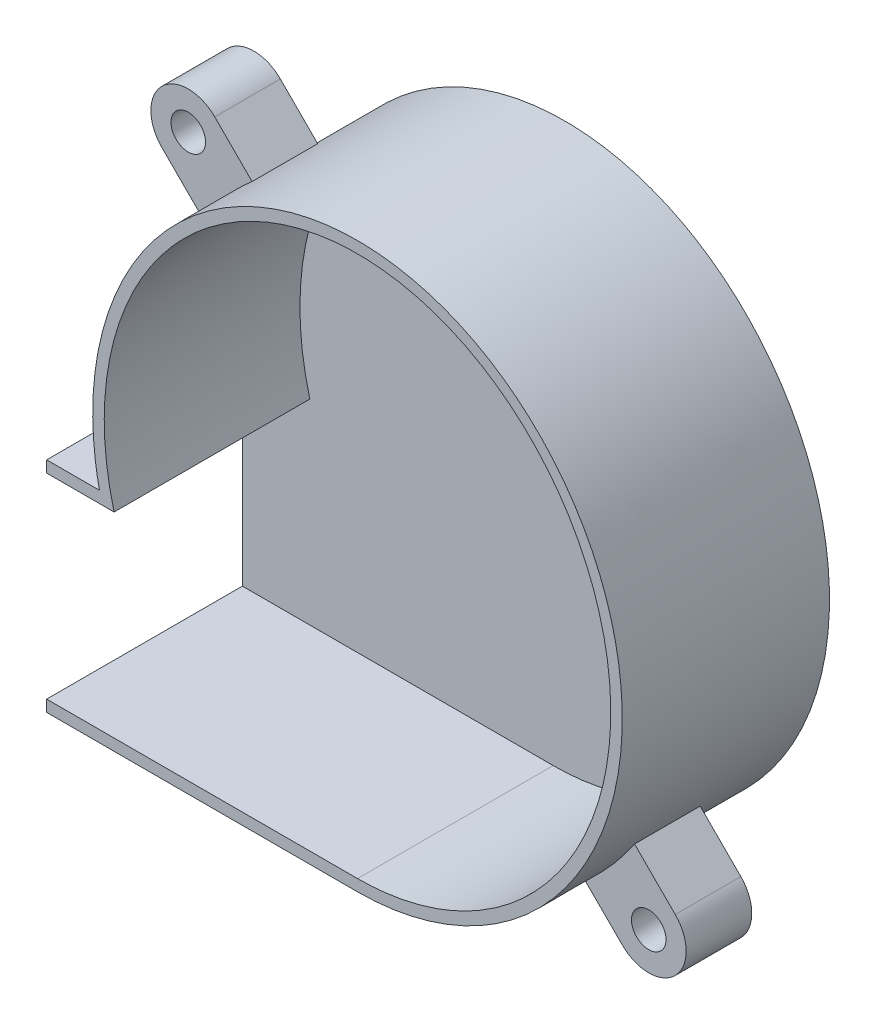
ISO-10303-21;
HEADER;
FILE_DESCRIPTION(('STEP AP214'),'2;1');
FILE_NAME('part.step','',(''),(''),'','','');
FILE_SCHEMA(('AUTOMOTIVE_DESIGN { 1 0 10303 214 1 1 1 1 }'));
ENDSEC;
DATA;
#1=APPLICATION_CONTEXT('core data for automotive mechanical design processes');
#2=APPLICATION_PROTOCOL_DEFINITION('international standard','automotive_design',2000,#1);
#3=PRODUCT_CONTEXT('',#1,'mechanical');
#4=PRODUCT('Part','Part','',(#3));
#5=PRODUCT_RELATED_PRODUCT_CATEGORY('part','',(#4));
#6=PRODUCT_DEFINITION_FORMATION('','',#4);
#7=PRODUCT_DEFINITION_CONTEXT('part definition',#1,'design');
#8=PRODUCT_DEFINITION('design','',#6,#7);
#9=PRODUCT_DEFINITION_SHAPE('','',#8);
#10=(LENGTH_UNIT() NAMED_UNIT(*) SI_UNIT(.MILLI.,.METRE.));
#11=(NAMED_UNIT(*) PLANE_ANGLE_UNIT() SI_UNIT($,.RADIAN.));
#12=(NAMED_UNIT(*) SI_UNIT($,.STERADIAN.) SOLID_ANGLE_UNIT());
#13=UNCERTAINTY_MEASURE_WITH_UNIT(LENGTH_MEASURE(1.E-05),#10,'distance_accuracy_value','');
#14=(GEOMETRIC_REPRESENTATION_CONTEXT(3) GLOBAL_UNCERTAINTY_ASSIGNED_CONTEXT((#13)) GLOBAL_UNIT_ASSIGNED_CONTEXT((#10,
#11,#12)) REPRESENTATION_CONTEXT('',''));
#15=CARTESIAN_POINT('',(0.,0.,0.));
#16=DIRECTION('',(0.,0.,1.));
#17=DIRECTION('',(1.,0.,0.));
#18=AXIS2_PLACEMENT_3D('',#15,#16,#17);
#19=CARTESIAN_POINT('',(0.,0.,1.));
#20=DIRECTION('',(0.,0.,1.));
#21=DIRECTION('',(0.,1.,0.));
#22=AXIS2_PLACEMENT_3D('',#19,#20,#21);
#23=ELLIPSE('',#22,24.5,23.);
#24=DIRECTION('',(0.,0.,-1.));
#25=VECTOR('',#24,1.);
#26=SURFACE_OF_LINEAR_EXTRUSION('',#23,#25);
#27=CARTESIAN_POINT('',(0.,0.,0.));
#28=DIRECTION('',(0.,0.,1.));
#29=DIRECTION('',(0.,1.,0.));
#30=AXIS2_PLACEMENT_3D('',#27,#28,#29);
#31=ELLIPSE('',#30,24.5,23.);
#32=CARTESIAN_POINT('',(0.,-24.5,0.));
#33=VERTEX_POINT('',#32);
#34=CARTESIAN_POINT('',(-22.4129581130781,-5.5,0.));
#35=VERTEX_POINT('',#34);
#36=EDGE_CURVE('E263',#33,#35,#31,.T.);
#37=ORIENTED_EDGE('',*,*,#36,.T.);
#38=DIRECTION('',(0.,0.,-1.));
#39=VECTOR('',#38,1.);
#40=CARTESIAN_POINT('',(-22.4129581130781,-5.5,1.));
#41=LINE('',#40,#39);
#42=CARTESIAN_POINT('',(-22.4129581130781,-5.5,18.));
#43=VERTEX_POINT('',#42);
#44=EDGE_CURVE('E42',#43,#35,#41,.T.);
#45=ORIENTED_EDGE('',*,*,#44,.F.);
#46=CARTESIAN_POINT('',(0.,0.,18.));
#47=DIRECTION('',(0.,0.,1.));
#48=DIRECTION('',(0.,1.,0.));
#49=AXIS2_PLACEMENT_3D('',#46,#47,#48);
#50=ELLIPSE('',#49,24.5,23.);
#51=CARTESIAN_POINT('',(0.,-24.5,18.));
#52=VERTEX_POINT('',#51);
#53=EDGE_CURVE('E291',#52,#43,#50,.T.);
#54=ORIENTED_EDGE('',*,*,#53,.F.);
#55=DIRECTION('',(0.,0.,-1.));
#56=VECTOR('',#55,1.);
#57=CARTESIAN_POINT('',(0.,-24.5,1.));
#58=LINE('',#57,#56);
#59=EDGE_CURVE('E11',#52,#33,#58,.T.);
#60=ORIENTED_EDGE('',*,*,#59,.T.);
#61=EDGE_LOOP('',(#37,#45,#54,#60));
#62=FACE_BOUND('',#61,.T.);
#63=CARTESIAN_POINT('',(0.,0.,12.7));
#64=DIRECTION('',(0.,0.,-1.));
#65=DIRECTION('',(0.,1.,0.));
#66=AXIS2_PLACEMENT_3D('',#63,#64,#65);
#67=ELLIPSE('',#66,24.5,23.);
#68=CARTESIAN_POINT('',(18.7641912023517,-14.1679971246392,12.7));
#69=VERTEX_POINT('',#68);
#70=CARTESIAN_POINT('',(14.4579938729562,-19.0541879506688,12.7));
#71=VERTEX_POINT('',#70);
#72=EDGE_CURVE('E186',#69,#71,#67,.T.);
#73=ORIENTED_EDGE('',*,*,#72,.F.);
#74=DIRECTION('',(0.,0.,-1.));
#75=VECTOR('',#74,1.);
#76=CARTESIAN_POINT('',(18.7641912023517,-14.1679971246392,12.7));
#77=LINE('',#76,#75);
#78=CARTESIAN_POINT('',(18.7641912023517,-14.1679971246392,7.));
#79=VERTEX_POINT('',#78);
#80=EDGE_CURVE('E205',#69,#79,#77,.T.);
#81=ORIENTED_EDGE('',*,*,#80,.T.);
#82=CARTESIAN_POINT('',(0.,0.,7.));
#83=DIRECTION('',(0.,0.,-1.));
#84=DIRECTION('',(0.,1.,0.));
#85=AXIS2_PLACEMENT_3D('',#82,#83,#84);
#86=ELLIPSE('',#85,24.5,23.);
#87=CARTESIAN_POINT('',(14.4579938729562,-19.0541879506688,7.));
#88=VERTEX_POINT('',#87);
#89=EDGE_CURVE('E197',#79,#88,#86,.T.);
#90=ORIENTED_EDGE('',*,*,#89,.T.);
#91=DIRECTION('',(0.,0.,-1.));
#92=VECTOR('',#91,1.);
#93=CARTESIAN_POINT('',(14.4579938729562,-19.0541879506688,12.7));
#94=LINE('',#93,#92);
#95=EDGE_CURVE('E202',#71,#88,#94,.T.);
#96=ORIENTED_EDGE('',*,*,#95,.F.);
#97=EDGE_LOOP('',(#73,#81,#90,#96));
#98=FACE_BOUND('',#97,.T.);
#99=DIRECTION('',(0.,0.,-1.));
#100=VECTOR('',#99,1.);
#101=CARTESIAN_POINT('',(-18.7641912023517,14.1679971246392,12.7));
#102=LINE('',#101,#100);
#103=CARTESIAN_POINT('',(-18.7641912023517,14.1679971246392,12.7));
#104=VERTEX_POINT('',#103);
#105=CARTESIAN_POINT('',(-18.7641912023517,14.1679971246392,7.));
#106=VERTEX_POINT('',#105);
#107=EDGE_CURVE('E55',#104,#106,#102,.T.);
#108=ORIENTED_EDGE('',*,*,#107,.T.);
#109=CARTESIAN_POINT('',(0.,0.,7.));
#110=DIRECTION('',(0.,0.,-1.));
#111=DIRECTION('',(0.,1.,0.));
#112=AXIS2_PLACEMENT_3D('',#109,#110,#111);
#113=ELLIPSE('',#112,24.5,23.);
#114=CARTESIAN_POINT('',(-14.4579938729562,19.0541879506688,7.));
#115=VERTEX_POINT('',#114);
#116=EDGE_CURVE('E548',#106,#115,#113,.T.);
#117=ORIENTED_EDGE('',*,*,#116,.T.);
#118=DIRECTION('',(0.,0.,-1.));
#119=VECTOR('',#118,1.);
#120=CARTESIAN_POINT('',(-14.4579938729562,19.0541879506688,12.7));
#121=LINE('',#120,#119);
#122=CARTESIAN_POINT('',(-14.4579938729562,19.0541879506688,12.7));
#123=VERTEX_POINT('',#122);
#124=EDGE_CURVE('E172',#123,#115,#121,.T.);
#125=ORIENTED_EDGE('',*,*,#124,.F.);
#126=CARTESIAN_POINT('',(0.,0.,12.7));
#127=DIRECTION('',(0.,0.,-1.));
#128=DIRECTION('',(0.,1.,0.));
#129=AXIS2_PLACEMENT_3D('',#126,#127,#128);
#130=ELLIPSE('',#129,24.5,23.);
#131=EDGE_CURVE('E50',#104,#123,#130,.T.);
#132=ORIENTED_EDGE('',*,*,#131,.F.);
#133=EDGE_LOOP('',(#108,#117,#125,#132));
#134=FACE_BOUND('',#133,.T.);
#135=ADVANCED_FACE('F33',(#62,#98,#134),#26,.F.);
#136=CARTESIAN_POINT('',(0.,0.,1.));
#137=DIRECTION('',(0.,0.,1.));
#138=DIRECTION('',(1.,0.,0.));
#139=AXIS2_PLACEMENT_3D('',#136,#137,#138);
#140=PLANE('',#139);
#141=CARTESIAN_POINT('',(-21.1415560322634,-6.5,1.));
#142=CARTESIAN_POINT('',(-21.7759040850454,-4.14616663162075,1.));
#143=CARTESIAN_POINT('',(-22.3500460661726,0.776913351469055,1.));
#144=CARTESIAN_POINT('',(-21.0411485837453,8.08553426296956,1.));
#145=CARTESIAN_POINT('',(-17.6937405646126,14.6032514803996,1.));
#146=CARTESIAN_POINT('',(-12.6420113209987,19.6989015023427,1.));
#147=CARTESIAN_POINT('',(-6.38255061293039,22.8884215040737,1.));
#148=CARTESIAN_POINT('',(0.481967818505515,23.8764200203381,1.));
#149=CARTESIAN_POINT('',(7.30093031096783,22.5731099930776,1.));
#150=CARTESIAN_POINT('',(13.4271662597007,19.097124392934,1.));
#151=CARTESIAN_POINT('',(18.2691214581346,13.7715197027639,1.));
#152=CARTESIAN_POINT('',(21.3495837922645,7.10381393233231,1.));
#153=CARTESIAN_POINT('',(22.3605885719932,-0.259019098050411,1.));
#154=CARTESIAN_POINT('',(21.2003019493631,-7.59647296507907,1.));
#155=CARTESIAN_POINT('',(17.9857877784713,-14.1907372017755,1.));
#156=CARTESIAN_POINT('',(13.0370136266574,-19.4025638833507,1.));
#157=CARTESIAN_POINT('',(6.84551830863374,-22.7360633797071,1.));
#158=CARTESIAN_POINT('',(2.27634490260257,-23.5,1.));
#159=CARTESIAN_POINT('',(0.,-23.5,1.));
#160=B_SPLINE_CURVE_WITH_KNOTS('',3,(#141,#142,#143,#144,#145,#146,#147,#148,#149,#150,#151,
#152,#153,#154,#155,#156,#157,#158,#159),.UNSPECIFIED.,.F.,.F.,(4,1,1,1,1,1,1,1,1,1,1,1,1,1,1,1,
4),(-3.14159265358979,-2.82959621533012,-2.51759977707045,-2.20560333881077,-1.8936069005511,
-1.58161046229143,-1.26961402403176,-0.957617585772083,-0.64562114751241,-0.333624709252737,
-0.0216282709930642,0.290368167266609,0.602364605526281,0.914361043785954,1.22635748204563,
1.5383539203053,1.85035035856497),.UNSPECIFIED.);
#161=CARTESIAN_POINT('',(0.,-23.5,1.));
#162=VERTEX_POINT('',#161);
#163=CARTESIAN_POINT('',(-21.1415560322634,-6.5,1.));
#164=VERTEX_POINT('',#163);
#165=EDGE_CURVE('E311',#162,#164,#160,.F.);
#166=ORIENTED_EDGE('',*,*,#165,.T.);
#167=DIRECTION('',(-1.,0.,0.));
#168=VECTOR('',#167,1.);
#169=CARTESIAN_POINT('',(0.,-6.49999999999998,1.));
#170=LINE('',#169,#168);
#171=CARTESIAN_POINT('',(-27.,-6.50000000000001,1.));
#172=VERTEX_POINT('',#171);
#173=EDGE_CURVE('E258',#164,#172,#170,.T.);
#174=ORIENTED_EDGE('',*,*,#173,.T.);
#175=DIRECTION('',(0.,1.,0.));
#176=VECTOR('',#175,1.);
#177=CARTESIAN_POINT('',(-27.,-24.5,1.));
#178=LINE('',#177,#176);
#179=CARTESIAN_POINT('',(-27.,-23.5,1.));
#180=VERTEX_POINT('',#179);
#181=EDGE_CURVE('E252',#180,#172,#178,.T.);
#182=ORIENTED_EDGE('',*,*,#181,.F.);
#183=DIRECTION('',(1.,0.,0.));
#184=VECTOR('',#183,1.);
#185=CARTESIAN_POINT('',(0.,-23.5,1.));
#186=LINE('',#185,#184);
#187=EDGE_CURVE('E308',#180,#162,#186,.T.);
#188=ORIENTED_EDGE('',*,*,#187,.T.);
#189=EDGE_LOOP('',(#166,#174,#182,#188));
#190=FACE_BOUND('',#189,.T.);
#191=ADVANCED_FACE('F236',(#190),#140,.T.);
#192=CARTESIAN_POINT('',(0.,-24.5,1.));
#193=DIRECTION('',(0.,-1.,0.));
#194=DIRECTION('',(1.,0.,0.));
#195=AXIS2_PLACEMENT_3D('',#192,#193,#194);
#196=PLANE('',#195);
#197=DIRECTION('',(-1.,0.,0.));
#198=VECTOR('',#197,1.);
#199=CARTESIAN_POINT('',(0.,-24.5,0.));
#200=LINE('',#199,#198);
#201=CARTESIAN_POINT('',(-27.,-24.5,0.));
#202=VERTEX_POINT('',#201);
#203=EDGE_CURVE('E254',#33,#202,#200,.T.);
#204=ORIENTED_EDGE('',*,*,#203,.F.);
#205=ORIENTED_EDGE('',*,*,#59,.F.);
#206=DIRECTION('',(-1.,0.,0.));
#207=VECTOR('',#206,1.);
#208=CARTESIAN_POINT('',(0.,-24.5,18.));
#209=LINE('',#208,#207);
#210=CARTESIAN_POINT('',(-27.,-24.5,18.));
#211=VERTEX_POINT('',#210);
#212=EDGE_CURVE('E295',#52,#211,#209,.T.);
#213=ORIENTED_EDGE('',*,*,#212,.T.);
#214=DIRECTION('',(0.,0.,-1.));
#215=VECTOR('',#214,1.);
#216=CARTESIAN_POINT('',(-27.,-24.5,1.));
#217=LINE('',#216,#215);
#218=EDGE_CURVE('E269',#211,#202,#217,.T.);
#219=ORIENTED_EDGE('',*,*,#218,.T.);
#220=EDGE_LOOP('',(#204,#205,#213,#219));
#221=FACE_BOUND('',#220,.T.);
#222=ADVANCED_FACE('F35',(#221),#196,.T.);
#223=CARTESIAN_POINT('',(-27.,-5.50000000000001,1.));
#224=DIRECTION('',(0.,1.,0.));
#225=DIRECTION('',(-1.,0.,0.));
#226=AXIS2_PLACEMENT_3D('',#223,#224,#225);
#227=PLANE('',#226);
#228=DIRECTION('',(1.,0.,0.));
#229=VECTOR('',#228,1.);
#230=CARTESIAN_POINT('',(-27.,-5.50000000000001,0.));
#231=LINE('',#230,#229);
#232=CARTESIAN_POINT('',(-27.,-5.50000000000001,0.));
#233=VERTEX_POINT('',#232);
#234=EDGE_CURVE('E260',#233,#35,#231,.T.);
#235=ORIENTED_EDGE('',*,*,#234,.F.);
#236=DIRECTION('',(0.,0.,-1.));
#237=VECTOR('',#236,1.);
#238=CARTESIAN_POINT('',(-27.,-5.50000000000001,1.));
#239=LINE('',#238,#237);
#240=CARTESIAN_POINT('',(-27.,-5.50000000000001,18.));
#241=VERTEX_POINT('',#240);
#242=EDGE_CURVE('E266',#241,#233,#239,.T.);
#243=ORIENTED_EDGE('',*,*,#242,.F.);
#244=DIRECTION('',(1.,0.,0.));
#245=VECTOR('',#244,1.);
#246=CARTESIAN_POINT('',(0.,-5.49999999999999,18.));
#247=LINE('',#246,#245);
#248=EDGE_CURVE('E276',#241,#43,#247,.T.);
#249=ORIENTED_EDGE('',*,*,#248,.T.);
#250=ORIENTED_EDGE('',*,*,#44,.T.);
#251=EDGE_LOOP('',(#235,#243,#249,#250));
#252=FACE_BOUND('',#251,.T.);
#253=ADVANCED_FACE('F248',(#252),#227,.T.);
#254=CARTESIAN_POINT('',(-27.,-24.5,1.));
#255=DIRECTION('',(-1.,0.,0.));
#256=DIRECTION('',(0.,0.,1.));
#257=AXIS2_PLACEMENT_3D('',#254,#255,#256);
#258=PLANE('',#257);
#259=DIRECTION('',(0.,0.,-1.));
#260=VECTOR('',#259,1.);
#261=CARTESIAN_POINT('',(-27.,-23.5,18.));
#262=LINE('',#261,#260);
#263=CARTESIAN_POINT('',(-27.,-23.5,18.));
#264=VERTEX_POINT('',#263);
#265=EDGE_CURVE('E300',#264,#180,#262,.T.);
#266=ORIENTED_EDGE('',*,*,#265,.T.);
#267=ORIENTED_EDGE('',*,*,#181,.T.);
#268=DIRECTION('',(0.,0.,-1.));
#269=VECTOR('',#268,1.);
#270=CARTESIAN_POINT('',(-27.,-6.50000000000001,18.));
#271=LINE('',#270,#269);
#272=CARTESIAN_POINT('',(-27.,-6.50000000000001,18.));
#273=VERTEX_POINT('',#272);
#274=EDGE_CURVE('E293',#273,#172,#271,.T.);
#275=ORIENTED_EDGE('',*,*,#274,.F.);
#276=DIRECTION('',(0.,1.,0.));
#277=VECTOR('',#276,1.);
#278=CARTESIAN_POINT('',(-27.,0.,18.));
#279=LINE('',#278,#277);
#280=EDGE_CURVE('E287',#273,#241,#279,.T.);
#281=ORIENTED_EDGE('',*,*,#280,.T.);
#282=ORIENTED_EDGE('',*,*,#242,.T.);
#283=DIRECTION('',(0.,1.,0.));
#284=VECTOR('',#283,1.);
#285=CARTESIAN_POINT('',(-27.,-24.5,0.));
#286=LINE('',#285,#284);
#287=EDGE_CURVE('E257',#202,#233,#286,.T.);
#288=ORIENTED_EDGE('',*,*,#287,.F.);
#289=ORIENTED_EDGE('',*,*,#218,.F.);
#290=EDGE_CURVE('E294',#211,#264,#279,.T.);
#291=ORIENTED_EDGE('',*,*,#290,.T.);
#292=EDGE_LOOP('',(#266,#267,#275,#281,#282,#288,#289,#291));
#293=FACE_BOUND('',#292,.T.);
#294=ADVANCED_FACE('F242',(#293),#258,.T.);
#295=CARTESIAN_POINT('',(0.,0.,0.));
#296=DIRECTION('',(0.,0.,1.));
#297=DIRECTION('',(1.,0.,0.));
#298=AXIS2_PLACEMENT_3D('',#295,#296,#297);
#299=PLANE('',#298);
#300=ORIENTED_EDGE('',*,*,#287,.T.);
#301=ORIENTED_EDGE('',*,*,#234,.T.);
#302=ORIENTED_EDGE('',*,*,#36,.F.);
#303=ORIENTED_EDGE('',*,*,#203,.T.);
#304=EDGE_LOOP('',(#300,#301,#302,#303));
#305=FACE_BOUND('',#304,.T.);
#306=ADVANCED_FACE('F234',(#305),#299,.F.);
#307=CARTESIAN_POINT('',(0.,-6.49999999999998,18.));
#308=DIRECTION('',(0.,1.,0.));
#309=DIRECTION('',(-1.,0.,0.));
#310=AXIS2_PLACEMENT_3D('',#307,#308,#309);
#311=PLANE('',#310);
#312=ORIENTED_EDGE('',*,*,#173,.F.);
#313=DIRECTION('',(0.,0.,-1.));
#314=VECTOR('',#313,1.);
#315=CARTESIAN_POINT('',(-21.1415560322634,-6.5,18.));
#316=LINE('',#315,#314);
#317=CARTESIAN_POINT('',(-21.1415560322634,-6.5,18.));
#318=VERTEX_POINT('',#317);
#319=EDGE_CURVE('E305',#318,#164,#316,.T.);
#320=ORIENTED_EDGE('',*,*,#319,.F.);
#321=DIRECTION('',(1.,0.,0.));
#322=VECTOR('',#321,1.);
#323=CARTESIAN_POINT('',(0.,-6.49999999999998,18.));
#324=LINE('',#323,#322);
#325=EDGE_CURVE('E210',#273,#318,#324,.T.);
#326=ORIENTED_EDGE('',*,*,#325,.F.);
#327=ORIENTED_EDGE('',*,*,#274,.T.);
#328=EDGE_LOOP('',(#312,#320,#326,#327));
#329=FACE_BOUND('',#328,.T.);
#330=ADVANCED_FACE('F229',(#329),#311,.F.);
#331=CARTESIAN_POINT('',(-21.1415560322634,-6.5,18.));
#332=CARTESIAN_POINT('',(-21.7759040850454,-4.14616663162075,18.));
#333=CARTESIAN_POINT('',(-22.3500460661726,0.776913351469055,18.));
#334=CARTESIAN_POINT('',(-21.0411485837453,8.08553426296956,18.));
#335=CARTESIAN_POINT('',(-17.6937405646126,14.6032514803996,18.));
#336=CARTESIAN_POINT('',(-12.6420113209987,19.6989015023427,18.));
#337=CARTESIAN_POINT('',(-6.38255061293039,22.8884215040737,18.));
#338=CARTESIAN_POINT('',(0.481967818505515,23.8764200203381,18.));
#339=CARTESIAN_POINT('',(7.30093031096783,22.5731099930776,18.));
#340=CARTESIAN_POINT('',(13.4271662597007,19.097124392934,18.));
#341=CARTESIAN_POINT('',(18.2691214581346,13.7715197027639,18.));
#342=CARTESIAN_POINT('',(21.3495837922645,7.10381393233231,18.));
#343=CARTESIAN_POINT('',(22.3605885719932,-0.259019098050411,18.));
#344=CARTESIAN_POINT('',(21.2003019493631,-7.59647296507907,18.));
#345=CARTESIAN_POINT('',(17.9857877784713,-14.1907372017755,18.));
#346=CARTESIAN_POINT('',(13.0370136266574,-19.4025638833507,18.));
#347=CARTESIAN_POINT('',(6.84551830863374,-22.7360633797071,18.));
#348=CARTESIAN_POINT('',(2.27634490260257,-23.5,18.));
#349=CARTESIAN_POINT('',(0.,-23.5,18.));
#350=B_SPLINE_CURVE_WITH_KNOTS('',3,(#331,#332,#333,#334,#335,#336,#337,#338,#339,#340,#341,
#342,#343,#344,#345,#346,#347,#348,#349),.UNSPECIFIED.,.F.,.F.,(4,1,1,1,1,1,1,1,1,1,1,1,1,1,1,1,
4),(-3.14159265358979,-2.82959621533012,-2.51759977707045,-2.20560333881077,-1.8936069005511,
-1.58161046229143,-1.26961402403176,-0.957617585772083,-0.64562114751241,-0.333624709252737,
-0.0216282709930642,0.290368167266609,0.602364605526281,0.914361043785954,1.22635748204563,
1.5383539203053,1.85035035856497),.UNSPECIFIED.);
#351=DIRECTION('',(0.,0.,-1.));
#352=VECTOR('',#351,1.);
#353=SURFACE_OF_LINEAR_EXTRUSION('',#350,#352);
#354=ORIENTED_EDGE('',*,*,#165,.F.);
#355=DIRECTION('',(0.,0.,-1.));
#356=VECTOR('',#355,1.);
#357=CARTESIAN_POINT('',(0.,-23.5,18.));
#358=LINE('',#357,#356);
#359=CARTESIAN_POINT('',(0.,-23.5,18.));
#360=VERTEX_POINT('',#359);
#361=EDGE_CURVE('E302',#360,#162,#358,.T.);
#362=ORIENTED_EDGE('',*,*,#361,.F.);
#363=EDGE_CURVE('E213',#318,#360,#350,.T.);
#364=ORIENTED_EDGE('',*,*,#363,.F.);
#365=ORIENTED_EDGE('',*,*,#319,.T.);
#366=EDGE_LOOP('',(#354,#362,#364,#365));
#367=FACE_BOUND('',#366,.T.);
#368=ADVANCED_FACE('F224',(#367),#353,.F.);
#369=CARTESIAN_POINT('',(0.,-23.5,18.));
#370=DIRECTION('',(0.,-1.,0.));
#371=DIRECTION('',(0.,0.,-1.));
#372=AXIS2_PLACEMENT_3D('',#369,#370,#371);
#373=PLANE('',#372);
#374=ORIENTED_EDGE('',*,*,#187,.F.);
#375=ORIENTED_EDGE('',*,*,#265,.F.);
#376=DIRECTION('',(-1.,0.,0.));
#377=VECTOR('',#376,1.);
#378=CARTESIAN_POINT('',(0.,-23.5,18.));
#379=LINE('',#378,#377);
#380=EDGE_CURVE('E218',#360,#264,#379,.T.);
#381=ORIENTED_EDGE('',*,*,#380,.F.);
#382=ORIENTED_EDGE('',*,*,#361,.T.);
#383=EDGE_LOOP('',(#374,#375,#381,#382));
#384=FACE_BOUND('',#383,.T.);
#385=ADVANCED_FACE('F228',(#384),#373,.F.);
#386=CARTESIAN_POINT('',(0.,0.,18.));
#387=DIRECTION('',(0.,0.,1.));
#388=DIRECTION('',(1.,0.,0.));
#389=AXIS2_PLACEMENT_3D('',#386,#387,#388);
#390=PLANE('',#389);
#391=ORIENTED_EDGE('',*,*,#325,.T.);
#392=ORIENTED_EDGE('',*,*,#363,.T.);
#393=ORIENTED_EDGE('',*,*,#380,.T.);
#394=ORIENTED_EDGE('',*,*,#290,.F.);
#395=ORIENTED_EDGE('',*,*,#212,.F.);
#396=ORIENTED_EDGE('',*,*,#53,.T.);
#397=ORIENTED_EDGE('',*,*,#248,.F.);
#398=ORIENTED_EDGE('',*,*,#280,.F.);
#399=EDGE_LOOP('',(#391,#392,#393,#394,#395,#396,#397,#398));
#400=FACE_BOUND('',#399,.T.);
#401=ADVANCED_FACE('F289',(#400),#390,.T.);
#402=CARTESIAN_POINT('',(0.,0.,12.7));
#403=DIRECTION('',(0.,0.,1.));
#404=DIRECTION('',(1.,0.,0.));
#405=AXIS2_PLACEMENT_3D('',#402,#403,#404);
#406=PLANE('',#405);
#407=CARTESIAN_POINT('',(20.,-20.0000000000001,12.7));
#408=DIRECTION('',(0.,0.,1.));
#409=DIRECTION('',(1.,0.,0.));
#410=AXIS2_PLACEMENT_3D('',#407,#408,#409);
#411=CIRCLE('',#410,3.25000000000001);
#412=CARTESIAN_POINT('',(17.7019029611437,-22.2980970388563,12.7));
#413=VERTEX_POINT('',#412);
#414=CARTESIAN_POINT('',(22.2980970388563,-17.7019029611438,12.7));
#415=VERTEX_POINT('',#414);
#416=EDGE_CURVE('E179',#413,#415,#411,.T.);
#417=ORIENTED_EDGE('',*,*,#416,.T.);
#418=DIRECTION('',(-0.707106781186547,0.707106781186548,0.));
#419=VECTOR('',#418,1.);
#420=CARTESIAN_POINT('',(22.2980970388563,-17.7019029611438,12.7));
#421=LINE('',#420,#419);
#422=EDGE_CURVE('E182',#415,#69,#421,.T.);
#423=ORIENTED_EDGE('',*,*,#422,.T.);
#424=ORIENTED_EDGE('',*,*,#72,.T.);
#425=DIRECTION('',(0.707106781186545,-0.70710678118655,0.));
#426=VECTOR('',#425,1.);
#427=CARTESIAN_POINT('',(17.7019029611437,-22.2980970388563,12.7));
#428=LINE('',#427,#426);
#429=EDGE_CURVE('E189',#71,#413,#428,.T.);
#430=ORIENTED_EDGE('',*,*,#429,.T.);
#431=EDGE_LOOP('',(#417,#423,#424,#430));
#432=FACE_BOUND('',#431,.T.);
#433=CARTESIAN_POINT('',(20.,-20.0000000000001,12.7));
#434=DIRECTION('',(0.,0.,1.));
#435=DIRECTION('',(1.,0.,0.));
#436=AXIS2_PLACEMENT_3D('',#433,#434,#435);
#437=CIRCLE('',#436,1.5);
#438=CARTESIAN_POINT('',(21.5,-20.0000000000001,12.7));
#439=VERTEX_POINT('',#438);
#440=EDGE_CURVE('E170',#439,#439,#437,.T.);
#441=ORIENTED_EDGE('',*,*,#440,.F.);
#442=EDGE_LOOP('',(#441));
#443=FACE_BOUND('',#442,.T.);
#444=ADVANCED_FACE('F363',(#432,#443),#406,.T.);
#445=CARTESIAN_POINT('',(0.,0.,7.));
#446=DIRECTION('',(0.,0.,1.));
#447=DIRECTION('',(1.,0.,0.));
#448=AXIS2_PLACEMENT_3D('',#445,#446,#447);
#449=PLANE('',#448);
#450=CARTESIAN_POINT('',(20.,-20.0000000000001,7.));
#451=DIRECTION('',(0.,0.,1.));
#452=DIRECTION('',(1.,0.,0.));
#453=AXIS2_PLACEMENT_3D('',#450,#451,#452);
#454=CIRCLE('',#453,3.25000000000001);
#455=CARTESIAN_POINT('',(17.7019029611437,-22.2980970388563,7.));
#456=VERTEX_POINT('',#455);
#457=CARTESIAN_POINT('',(22.2980970388563,-17.7019029611438,7.));
#458=VERTEX_POINT('',#457);
#459=EDGE_CURVE('E177',#456,#458,#454,.T.);
#460=ORIENTED_EDGE('',*,*,#459,.F.);
#461=DIRECTION('',(0.707106781186545,-0.70710678118655,0.));
#462=VECTOR('',#461,1.);
#463=CARTESIAN_POINT('',(17.7019029611437,-22.2980970388563,7.));
#464=LINE('',#463,#462);
#465=EDGE_CURVE('E183',#88,#456,#464,.T.);
#466=ORIENTED_EDGE('',*,*,#465,.F.);
#467=ORIENTED_EDGE('',*,*,#89,.F.);
#468=DIRECTION('',(-0.707106781186547,0.707106781186548,0.));
#469=VECTOR('',#468,1.);
#470=CARTESIAN_POINT('',(22.2980970388563,-17.7019029611438,7.));
#471=LINE('',#470,#469);
#472=EDGE_CURVE('E194',#458,#79,#471,.T.);
#473=ORIENTED_EDGE('',*,*,#472,.F.);
#474=EDGE_LOOP('',(#460,#466,#467,#473));
#475=FACE_BOUND('',#474,.T.);
#476=CARTESIAN_POINT('',(20.,-20.0000000000001,7.));
#477=DIRECTION('',(0.,0.,1.));
#478=DIRECTION('',(1.,0.,0.));
#479=AXIS2_PLACEMENT_3D('',#476,#477,#478);
#480=CIRCLE('',#479,1.5);
#481=CARTESIAN_POINT('',(21.5,-20.0000000000001,7.));
#482=VERTEX_POINT('',#481);
#483=EDGE_CURVE('E167',#482,#482,#480,.T.);
#484=ORIENTED_EDGE('',*,*,#483,.T.);
#485=EDGE_LOOP('',(#484));
#486=FACE_BOUND('',#485,.T.);
#487=ADVANCED_FACE('F370',(#475,#486),#449,.F.);
#488=CARTESIAN_POINT('',(20.,-20.0000000000001,12.7));
#489=DIRECTION('',(0.,0.,-1.));
#490=DIRECTION('',(-1.,0.,0.));
#491=AXIS2_PLACEMENT_3D('',#488,#489,#490);
#492=CYLINDRICAL_SURFACE('',#491,3.25000000000001);
#493=ORIENTED_EDGE('',*,*,#459,.T.);
#494=DIRECTION('',(0.,0.,-1.));
#495=VECTOR('',#494,1.);
#496=CARTESIAN_POINT('',(22.2980970388563,-17.7019029611438,12.7));
#497=LINE('',#496,#495);
#498=EDGE_CURVE('E207',#415,#458,#497,.T.);
#499=ORIENTED_EDGE('',*,*,#498,.F.);
#500=ORIENTED_EDGE('',*,*,#416,.F.);
#501=DIRECTION('',(0.,0.,-1.));
#502=VECTOR('',#501,1.);
#503=CARTESIAN_POINT('',(17.7019029611437,-22.2980970388563,12.7));
#504=LINE('',#503,#502);
#505=EDGE_CURVE('E191',#413,#456,#504,.T.);
#506=ORIENTED_EDGE('',*,*,#505,.T.);
#507=EDGE_LOOP('',(#493,#499,#500,#506));
#508=FACE_BOUND('',#507,.T.);
#509=ADVANCED_FACE('F378',(#508),#492,.T.);
#510=CARTESIAN_POINT('',(22.2980970388563,-17.7019029611438,12.7));
#511=DIRECTION('',(-0.707106781186548,-0.707106781186547,0.));
#512=DIRECTION('',(0.707106781186547,-0.707106781186548,0.));
#513=AXIS2_PLACEMENT_3D('',#510,#511,#512);
#514=PLANE('',#513);
#515=ORIENTED_EDGE('',*,*,#472,.T.);
#516=ORIENTED_EDGE('',*,*,#80,.F.);
#517=ORIENTED_EDGE('',*,*,#422,.F.);
#518=ORIENTED_EDGE('',*,*,#498,.T.);
#519=EDGE_LOOP('',(#515,#516,#517,#518));
#520=FACE_BOUND('',#519,.T.);
#521=ADVANCED_FACE('F386',(#520),#514,.F.);
#522=CARTESIAN_POINT('',(17.7019029611437,-22.2980970388563,12.7));
#523=DIRECTION('',(0.70710678118655,0.707106781186545,0.));
#524=DIRECTION('',(-0.707106781186545,0.70710678118655,0.));
#525=AXIS2_PLACEMENT_3D('',#522,#523,#524);
#526=PLANE('',#525);
#527=ORIENTED_EDGE('',*,*,#465,.T.);
#528=ORIENTED_EDGE('',*,*,#505,.F.);
#529=ORIENTED_EDGE('',*,*,#429,.F.);
#530=ORIENTED_EDGE('',*,*,#95,.T.);
#531=EDGE_LOOP('',(#527,#528,#529,#530));
#532=FACE_BOUND('',#531,.T.);
#533=ADVANCED_FACE('F394',(#532),#526,.F.);
#534=CARTESIAN_POINT('',(20.,-20.0000000000001,12.7));
#535=DIRECTION('',(0.,0.,-1.));
#536=DIRECTION('',(-1.,0.,0.));
#537=AXIS2_PLACEMENT_3D('',#534,#535,#536);
#538=CYLINDRICAL_SURFACE('',#537,1.5);
#539=ORIENTED_EDGE('',*,*,#440,.T.);
#540=EDGE_LOOP('',(#539));
#541=FACE_BOUND('',#540,.T.);
#542=ORIENTED_EDGE('',*,*,#483,.F.);
#543=EDGE_LOOP('',(#542));
#544=FACE_BOUND('',#543,.T.);
#545=ADVANCED_FACE('F402',(#541,#544),#538,.F.);
#546=CARTESIAN_POINT('',(0.,0.,12.7));
#547=DIRECTION('',(0.,0.,1.));
#548=DIRECTION('',(1.,0.,0.));
#549=AXIS2_PLACEMENT_3D('',#546,#547,#548);
#550=PLANE('',#549);
#551=CARTESIAN_POINT('',(-20.,20.0000000000001,12.7));
#552=DIRECTION('',(0.,0.,1.));
#553=DIRECTION('',(1.,0.,0.));
#554=AXIS2_PLACEMENT_3D('',#551,#552,#553);
#555=CIRCLE('',#554,3.25000000000001);
#556=CARTESIAN_POINT('',(-17.7019029611437,22.2980970388563,12.7));
#557=VERTEX_POINT('',#556);
#558=CARTESIAN_POINT('',(-22.2980970388563,17.7019029611438,12.7));
#559=VERTEX_POINT('',#558);
#560=EDGE_CURVE('E152',#557,#559,#555,.T.);
#561=ORIENTED_EDGE('',*,*,#560,.T.);
#562=DIRECTION('',(0.70710678118655,-0.707106781186545,0.));
#563=VECTOR('',#562,1.);
#564=CARTESIAN_POINT('',(-18.7641912023517,14.1679971246392,12.7));
#565=LINE('',#564,#563);
#566=EDGE_CURVE('E145',#559,#104,#565,.T.);
#567=ORIENTED_EDGE('',*,*,#566,.T.);
#568=ORIENTED_EDGE('',*,*,#131,.T.);
#569=DIRECTION('',(-0.707106781186546,0.707106781186549,0.));
#570=VECTOR('',#569,1.);
#571=CARTESIAN_POINT('',(-14.4579938729562,19.0541879506688,12.7));
#572=LINE('',#571,#570);
#573=EDGE_CURVE('E158',#123,#557,#572,.T.);
#574=ORIENTED_EDGE('',*,*,#573,.T.);
#575=EDGE_LOOP('',(#561,#567,#568,#574));
#576=FACE_BOUND('',#575,.T.);
#577=CARTESIAN_POINT('',(-20.,20.0000000000001,12.7));
#578=DIRECTION('',(0.,0.,1.));
#579=DIRECTION('',(1.,0.,0.));
#580=AXIS2_PLACEMENT_3D('',#577,#578,#579);
#581=CIRCLE('',#580,1.5);
#582=CARTESIAN_POINT('',(-18.5,20.0000000000001,12.7));
#583=VERTEX_POINT('',#582);
#584=EDGE_CURVE('E534',#583,#583,#581,.T.);
#585=ORIENTED_EDGE('',*,*,#584,.F.);
#586=EDGE_LOOP('',(#585));
#587=FACE_BOUND('',#586,.T.);
#588=ADVANCED_FACE('F155',(#576,#587),#550,.T.);
#589=CARTESIAN_POINT('',(0.,0.,7.));
#590=DIRECTION('',(0.,0.,1.));
#591=DIRECTION('',(1.,0.,0.));
#592=AXIS2_PLACEMENT_3D('',#589,#590,#591);
#593=PLANE('',#592);
#594=CARTESIAN_POINT('',(-20.,20.0000000000001,7.));
#595=DIRECTION('',(0.,0.,1.));
#596=DIRECTION('',(1.,0.,0.));
#597=AXIS2_PLACEMENT_3D('',#594,#595,#596);
#598=CIRCLE('',#597,3.25000000000001);
#599=CARTESIAN_POINT('',(-17.7019029611437,22.2980970388563,7.));
#600=VERTEX_POINT('',#599);
#601=CARTESIAN_POINT('',(-22.2980970388563,17.7019029611438,7.));
#602=VERTEX_POINT('',#601);
#603=EDGE_CURVE('E166',#600,#602,#598,.T.);
#604=ORIENTED_EDGE('',*,*,#603,.F.);
#605=DIRECTION('',(-0.707106781186546,0.707106781186549,0.));
#606=VECTOR('',#605,1.);
#607=CARTESIAN_POINT('',(-14.4579938729562,19.0541879506688,7.));
#608=LINE('',#607,#606);
#609=EDGE_CURVE('E162',#115,#600,#608,.T.);
#610=ORIENTED_EDGE('',*,*,#609,.F.);
#611=ORIENTED_EDGE('',*,*,#116,.F.);
#612=DIRECTION('',(0.70710678118655,-0.707106781186545,0.));
#613=VECTOR('',#612,1.);
#614=CARTESIAN_POINT('',(-18.7641912023517,14.1679971246392,7.));
#615=LINE('',#614,#613);
#616=EDGE_CURVE('E546',#602,#106,#615,.T.);
#617=ORIENTED_EDGE('',*,*,#616,.F.);
#618=EDGE_LOOP('',(#604,#610,#611,#617));
#619=FACE_BOUND('',#618,.T.);
#620=CARTESIAN_POINT('',(-20.,20.0000000000001,7.));
#621=DIRECTION('',(0.,0.,1.));
#622=DIRECTION('',(1.,0.,0.));
#623=AXIS2_PLACEMENT_3D('',#620,#621,#622);
#624=CIRCLE('',#623,1.5);
#625=CARTESIAN_POINT('',(-18.5,20.0000000000001,7.));
#626=VERTEX_POINT('',#625);
#627=EDGE_CURVE('E537',#626,#626,#624,.T.);
#628=ORIENTED_EDGE('',*,*,#627,.T.);
#629=EDGE_LOOP('',(#628));
#630=FACE_BOUND('',#629,.T.);
#631=ADVANCED_FACE('F417',(#619,#630),#593,.F.);
#632=CARTESIAN_POINT('',(-20.,20.0000000000001,12.7));
#633=DIRECTION('',(0.,0.,-1.));
#634=DIRECTION('',(-1.,0.,0.));
#635=AXIS2_PLACEMENT_3D('',#632,#633,#634);
#636=CYLINDRICAL_SURFACE('',#635,3.25000000000001);
#637=ORIENTED_EDGE('',*,*,#603,.T.);
#638=DIRECTION('',(0.,0.,-1.));
#639=VECTOR('',#638,1.);
#640=CARTESIAN_POINT('',(-22.2980970388563,17.7019029611438,12.7));
#641=LINE('',#640,#639);
#642=EDGE_CURVE('E149',#559,#602,#641,.T.);
#643=ORIENTED_EDGE('',*,*,#642,.F.);
#644=ORIENTED_EDGE('',*,*,#560,.F.);
#645=DIRECTION('',(0.,0.,-1.));
#646=VECTOR('',#645,1.);
#647=CARTESIAN_POINT('',(-17.7019029611437,22.2980970388563,12.7));
#648=LINE('',#647,#646);
#649=EDGE_CURVE('E544',#557,#600,#648,.T.);
#650=ORIENTED_EDGE('',*,*,#649,.T.);
#651=EDGE_LOOP('',(#637,#643,#644,#650));
#652=FACE_BOUND('',#651,.T.);
#653=ADVANCED_FACE('F164',(#652),#636,.T.);
#654=CARTESIAN_POINT('',(-18.7641912023517,14.1679971246392,12.7));
#655=DIRECTION('',(0.707106781186545,0.70710678118655,0.));
#656=DIRECTION('',(-0.70710678118655,0.707106781186545,0.));
#657=AXIS2_PLACEMENT_3D('',#654,#655,#656);
#658=PLANE('',#657);
#659=ORIENTED_EDGE('',*,*,#616,.T.);
#660=ORIENTED_EDGE('',*,*,#107,.F.);
#661=ORIENTED_EDGE('',*,*,#566,.F.);
#662=ORIENTED_EDGE('',*,*,#642,.T.);
#663=EDGE_LOOP('',(#659,#660,#661,#662));
#664=FACE_BOUND('',#663,.T.);
#665=ADVANCED_FACE('F147',(#664),#658,.F.);
#666=CARTESIAN_POINT('',(-14.4579938729562,19.0541879506688,12.7));
#667=DIRECTION('',(-0.707106781186549,-0.707106781186546,0.));
#668=DIRECTION('',(0.707106781186546,-0.707106781186549,0.));
#669=AXIS2_PLACEMENT_3D('',#666,#667,#668);
#670=PLANE('',#669);
#671=ORIENTED_EDGE('',*,*,#609,.T.);
#672=ORIENTED_EDGE('',*,*,#649,.F.);
#673=ORIENTED_EDGE('',*,*,#573,.F.);
#674=ORIENTED_EDGE('',*,*,#124,.T.);
#675=EDGE_LOOP('',(#671,#672,#673,#674));
#676=FACE_BOUND('',#675,.T.);
#677=ADVANCED_FACE('F437',(#676),#670,.F.);
#678=CARTESIAN_POINT('',(-20.,20.0000000000001,12.7));
#679=DIRECTION('',(0.,0.,-1.));
#680=DIRECTION('',(-1.,0.,0.));
#681=AXIS2_PLACEMENT_3D('',#678,#679,#680);
#682=CYLINDRICAL_SURFACE('',#681,1.5);
#683=ORIENTED_EDGE('',*,*,#584,.T.);
#684=EDGE_LOOP('',(#683));
#685=FACE_BOUND('',#684,.T.);
#686=ORIENTED_EDGE('',*,*,#627,.F.);
#687=EDGE_LOOP('',(#686));
#688=FACE_BOUND('',#687,.T.);
#689=ADVANCED_FACE('F444',(#685,#688),#682,.F.);
#690=CLOSED_SHELL('',(#135,#191,#222,#253,#294,#306,#330,#368,#385,#401,#444,#487,#509,#521,
#533,#545,#588,#631,#653,#665,#677,#689));
#691=MANIFOLD_SOLID_BREP('B2',#690);
#692=ADVANCED_BREP_SHAPE_REPRESENTATION('',(#18,#691),#14);
#693=SHAPE_DEFINITION_REPRESENTATION(#9,#692);
ENDSEC;
END-ISO-10303-21;
